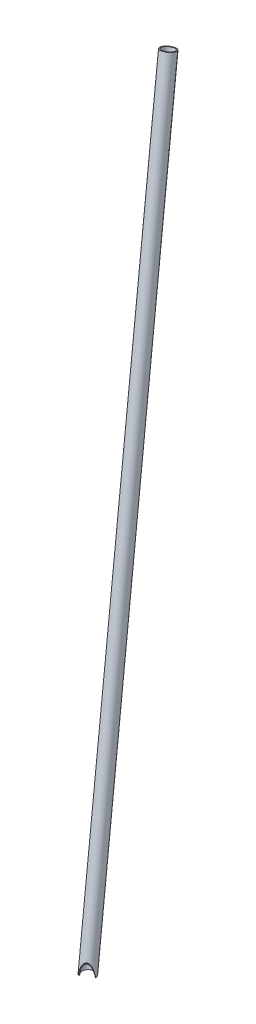
ISO-10303-21;
HEADER;
FILE_DESCRIPTION(('STEP AP214'),'2;1');
FILE_NAME('part.step','',(''),(''),'','','');
FILE_SCHEMA(('AUTOMOTIVE_DESIGN { 1 0 10303 214 1 1 1 1 }'));
ENDSEC;
DATA;
#1=APPLICATION_CONTEXT('core data for automotive mechanical design processes');
#2=APPLICATION_PROTOCOL_DEFINITION('international standard','automotive_design',2000,#1);
#3=PRODUCT_CONTEXT('',#1,'mechanical');
#4=PRODUCT('Part','Part','',(#3));
#5=PRODUCT_RELATED_PRODUCT_CATEGORY('part','',(#4));
#6=PRODUCT_DEFINITION_FORMATION('','',#4);
#7=PRODUCT_DEFINITION_CONTEXT('part definition',#1,'design');
#8=PRODUCT_DEFINITION('design','',#6,#7);
#9=PRODUCT_DEFINITION_SHAPE('','',#8);
#10=(LENGTH_UNIT() NAMED_UNIT(*) SI_UNIT(.MILLI.,.METRE.));
#11=(NAMED_UNIT(*) PLANE_ANGLE_UNIT() SI_UNIT($,.RADIAN.));
#12=(NAMED_UNIT(*) SI_UNIT($,.STERADIAN.) SOLID_ANGLE_UNIT());
#13=UNCERTAINTY_MEASURE_WITH_UNIT(LENGTH_MEASURE(1.E-05),#10,'distance_accuracy_value','');
#14=(GEOMETRIC_REPRESENTATION_CONTEXT(3) GLOBAL_UNCERTAINTY_ASSIGNED_CONTEXT((#13)) GLOBAL_UNIT_ASSIGNED_CONTEXT((#10,
#11,#12)) REPRESENTATION_CONTEXT('',''));
#15=CARTESIAN_POINT('',(0.,0.,0.));
#16=DIRECTION('',(0.,0.,1.));
#17=DIRECTION('',(1.,0.,0.));
#18=AXIS2_PLACEMENT_3D('',#15,#16,#17);
#19=CARTESIAN_POINT('',(250.,1.11022302462516E-13,-1700.));
#20=DIRECTION('',(-0.140336447675245,0.956366902675742,-0.256257739239816));
#21=DIRECTION('',(0.,0.258819045102517,0.965925826289069));
#22=AXIS2_PLACEMENT_3D('',#19,#20,#21);
#23=CYLINDRICAL_SURFACE('',#22,7.90000000000002);
#24=CARTESIAN_POINT('',(247.02688014993,22.3059316567872,-1697.79817454862));
#25=CARTESIAN_POINT('',(246.897230024097,22.1083342257185,-1697.7452263696));
#26=CARTESIAN_POINT('',(246.772514884946,21.9064915936007,-1697.69597642428));
#27=CARTESIAN_POINT('',(246.531632915779,21.4962913928115,-1697.60396431536));
#28=CARTESIAN_POINT('',(246.415469347105,21.2879313813088,-1697.56120462042));
#29=CARTESIAN_POINT('',(246.190485072449,20.8658404013037,-1697.48143432392));
#30=CARTESIAN_POINT('',(246.081674882731,20.6521023164945,-1697.44443186144));
#31=CARTESIAN_POINT('',(245.870690561491,20.220592835496,-1697.37571259438));
#32=CARTESIAN_POINT('',(245.768515631093,20.0028219289261,-1697.34399515277));
#33=CARTESIAN_POINT('',(245.56930824599,19.5623765931673,-1697.28521339645));
#34=CARTESIAN_POINT('',(245.47231897334,19.339677922274,-1697.25818489174));
#35=CARTESIAN_POINT('',(245.283654118844,18.8915257835523,-1697.20875916257));
#36=CARTESIAN_POINT('',(245.191979001067,18.6660720772105,-1697.18636234215));
#37=CARTESIAN_POINT('',(244.924230548213,17.9866730843641,-1697.12579739923));
#38=CARTESIAN_POINT('',(244.755265021636,17.5293099104588,-1697.09420518773));
#39=CARTESIAN_POINT('',(244.494879339238,16.7855656296779,-1697.05667906413));
#40=CARTESIAN_POINT('',(244.398631224781,16.5010873399011,-1697.04554992038));
#41=CARTESIAN_POINT('',(244.211349198765,15.9302231024051,-1697.02965612067));
#42=CARTESIAN_POINT('',(244.12031544369,15.6438370977223,-1697.02489165563));
#43=CARTESIAN_POINT('',(243.942824597102,15.0694384173663,-1697.02190040254));
#44=CARTESIAN_POINT('',(243.856370213951,14.7814248881377,-1697.02367744045));
#45=CARTESIAN_POINT('',(243.6875630043,14.2043282772833,-1697.03413793823));
#46=CARTESIAN_POINT('',(243.605210087314,13.9152452194044,-1697.04282124565));
#47=CARTESIAN_POINT('',(243.444529896558,13.3379076074676,-1697.06760242797));
#48=CARTESIAN_POINT('',(243.366183822315,13.049656626866,-1697.08366128966));
#49=CARTESIAN_POINT('',(243.212592422191,12.4728760762426,-1697.12400947113));
#50=CARTESIAN_POINT('',(243.137347299321,12.1843464892427,-1697.14829932882));
#51=CARTESIAN_POINT('',(242.989580963977,11.607754497176,-1697.20625762543));
#52=CARTESIAN_POINT('',(242.917057742486,11.319691903913,-1697.23991898644));
#53=CARTESIAN_POINT('',(242.774277386315,10.744526719946,-1697.31823847948));
#54=CARTESIAN_POINT('',(242.704019830467,10.4574239598153,-1697.36289455422));
#55=CARTESIAN_POINT('',(242.583318013298,9.95903009553073,-1697.4522075741));
#56=CARTESIAN_POINT('',(242.53244330234,9.74731121833546,-1697.49388514516));
#57=CARTESIAN_POINT('',(242.431650096973,9.3254764730985,-1697.58573669226));
#58=CARTESIAN_POINT('',(242.381731590056,9.11536058410989,-1697.63591055708));
#59=CARTESIAN_POINT('',(242.282706242084,8.69698634977353,-1697.74638354004));
#60=CARTESIAN_POINT('',(242.233601770432,8.48873403896588,-1697.8067079202));
#61=CARTESIAN_POINT('',(242.136449564854,8.07573373456303,-1697.93923568417));
#62=CARTESIAN_POINT('',(242.088401890844,7.87098593980351,-1698.01143973955));
#63=CARTESIAN_POINT('',(241.992857156138,7.46290686020257,-1698.17132522457));
#64=CARTESIAN_POINT('',(241.945386020607,7.25966913288363,-1698.25926436237));
#65=CARTESIAN_POINT('',(241.85268487176,6.86078816567063,-1698.45217985527));
#66=CARTESIAN_POINT('',(241.807454972283,6.66514531165063,-1698.55715707464));
#67=CARTESIAN_POINT('',(241.720851950301,6.28552972299374,-1698.7858161731));
#68=CARTESIAN_POINT('',(241.679459878051,6.10150125961276,-1698.90939726193));
#69=CARTESIAN_POINT('',(241.602379146249,5.74765270894294,-1699.17697362791));
#70=CARTESIAN_POINT('',(241.566686275014,5.57782217409105,-1699.32095368043));
#71=CARTESIAN_POINT('',(241.513402110687,5.30529454779575,-1699.58145988783));
#72=CARTESIAN_POINT('',(241.493621035359,5.1980266739728,-1699.69279065001));
#73=CARTESIAN_POINT('',(241.45904595535,4.99264615677945,-1699.92431627413));
#74=CARTESIAN_POINT('',(241.444251254099,4.89453223603746,-1700.04450989511));
#75=CARTESIAN_POINT('',(241.420552817406,4.70778223532026,-1700.29279839605));
#76=CARTESIAN_POINT('',(241.41165580788,4.61915707283636,-1700.42090211563));
#77=CARTESIAN_POINT('',(241.400574092195,4.45149219635069,-1700.68351075842));
#78=CARTESIAN_POINT('',(241.39838987884,4.37245318650371,-1700.81801615086));
#79=CARTESIAN_POINT('',(241.401350285497,4.22402356532311,-1701.0911109572));
#80=CARTESIAN_POINT('',(241.40645124162,4.15457818365956,-1701.22967120449));
#81=CARTESIAN_POINT('',(241.424343018824,4.02413400842025,-1701.51020861628));
#82=CARTESIAN_POINT('',(241.437133803629,3.96313517500031,-1701.65218576466));
#83=CARTESIAN_POINT('',(241.470700963952,3.84876889879651,-1701.93831396657));
#84=CARTESIAN_POINT('',(241.491480956521,3.79540492767333,-1702.08246597631));
#85=CARTESIAN_POINT('',(241.541194031402,3.69550391099853,-1702.37173437741));
#86=CARTESIAN_POINT('',(241.570128333775,3.6489678886419,-1702.51685090992));
#87=CARTESIAN_POINT('',(241.641302921631,3.55523560766826,-1702.82930571212));
#88=CARTESIAN_POINT('',(241.684904345027,3.50903581218809,-1702.99663358932));
#89=CARTESIAN_POINT('',(241.783053820528,3.42352892962098,-1703.32982846406));
#90=CARTESIAN_POINT('',(241.837602646755,3.38422233034004,-1703.49569535742));
#91=CARTESIAN_POINT('',(241.957567542264,3.31150991137228,-1703.82483193606));
#92=CARTESIAN_POINT('',(242.022987214122,3.27810605544044,-1703.98810074061));
#93=CARTESIAN_POINT('',(242.164507964506,3.21638312784203,-1704.31093211043));
#94=CARTESIAN_POINT('',(242.240609897625,3.18806446341012,-1704.47049437798));
#95=CARTESIAN_POINT('',(242.418420349936,3.1309495985652,-1704.81425989489));
#96=CARTESIAN_POINT('',(242.522257999659,3.1030475069652,-1704.99751503604));
#97=CARTESIAN_POINT('',(242.744131329493,3.05249227057389,-1705.3559924831));
#98=CARTESIAN_POINT('',(242.862168536989,3.02983969121828,-1705.53121392206));
#99=CARTESIAN_POINT('',(243.111852496659,2.98905827554971,-1705.87232784362));
#100=CARTESIAN_POINT('',(243.243503777358,2.97093095138726,-1706.03821719353));
#101=CARTESIAN_POINT('',(243.519637873026,2.93866327614331,-1706.35935931059));
#102=CARTESIAN_POINT('',(243.664120641717,2.92452291068301,-1706.5146121161));
#103=CARTESIAN_POINT('',(243.972005223475,2.89926035492251,-1706.82023361771));
#104=CARTESIAN_POINT('',(244.135971948418,2.88830719960703,-1706.97004789611));
#105=CARTESIAN_POINT('',(244.475916408687,2.87001985259347,-1707.25562147768));
#106=CARTESIAN_POINT('',(244.651894613171,2.8626858023468,-1707.39138023133));
#107=CARTESIAN_POINT('',(245.014625101376,2.85146898871207,-1707.64779424637));
#108=CARTESIAN_POINT('',(245.201376957081,2.84758608831688,-1707.76845010717));
#109=CARTESIAN_POINT('',(245.584323950589,2.84323032018274,-1707.99377239865));
#110=CARTESIAN_POINT('',(245.780518953462,2.84275740373423,-1708.09843905772));
#111=CARTESIAN_POINT('',(246.179795519347,2.84529810733267,-1708.29051066619));
#112=CARTESIAN_POINT('',(246.382831913726,2.84829204487045,-1708.37800979691));
#113=CARTESIAN_POINT('',(246.795357133017,2.85794199994654,-1708.53592740542));
#114=CARTESIAN_POINT('',(247.004845967786,2.8645980230789,-1708.60634585713));
#115=CARTESIAN_POINT('',(247.428770828113,2.88191542480601,-1708.72972804798));
#116=CARTESIAN_POINT('',(247.643207537136,2.89257735989547,-1708.78268936009));
#117=CARTESIAN_POINT('',(248.07541944083,2.91839980221602,-1708.87093441629));
#118=CARTESIAN_POINT('',(248.293194622048,2.93356029132338,-1708.90621823161));
#119=CARTESIAN_POINT('',(248.7312683794,2.96911390976135,-1708.95917167383));
#120=CARTESIAN_POINT('',(248.951573277631,2.98952600788944,-1708.97677628892));
#121=CARTESIAN_POINT('',(249.392252490683,3.03644538713307,-1708.9942925016));
#122=CARTESIAN_POINT('',(249.612626808572,3.06295299246059,-1708.99420315786));
#123=CARTESIAN_POINT('',(250.051709824062,3.12320837273484,-1708.97667308602));
#124=CARTESIAN_POINT('',(250.270418393374,3.15695669960755,-1708.95923103484));
#125=CARTESIAN_POINT('',(250.704301169476,3.23313631142059,-1708.90755908916));
#126=CARTESIAN_POINT('',(250.919475944015,3.27556618652005,-1708.87333191923));
#127=CARTESIAN_POINT('',(251.309573588191,3.36310784021261,-1708.79584798553));
#128=CARTESIAN_POINT('',(251.485327362265,3.40664788470186,-1708.75498130431));
#129=CARTESIAN_POINT('',(251.831682141261,3.50230201346856,-1708.66280013763));
#130=CARTESIAN_POINT('',(252.002283965985,3.55441472502234,-1708.61148732457));
#131=CARTESIAN_POINT('',(252.336694635672,3.66852102760673,-1708.49941840225));
#132=CARTESIAN_POINT('',(252.500512379707,3.73050112199456,-1708.43867519469));
#133=CARTESIAN_POINT('',(252.819992432913,3.86582520094134,-1708.30893348875));
#134=CARTESIAN_POINT('',(252.975656293141,3.93916701365929,-1708.23993656867));
#135=CARTESIAN_POINT('',(253.252206365326,4.08535531724691,-1708.10724711853));
#136=CARTESIAN_POINT('',(253.374590577554,4.15628343175465,-1708.04456029082));
#137=CARTESIAN_POINT('',(253.611452931414,4.30752941026716,-1707.91569959542));
#138=CARTESIAN_POINT('',(253.725932746026,4.38784527758661,-1707.84952647088));
#139=CARTESIAN_POINT('',(253.9459575018,4.55805154531534,-1707.71503254341));
#140=CARTESIAN_POINT('',(254.051511745365,4.64793175124106,-1707.64671408087));
#141=CARTESIAN_POINT('',(254.253093954462,4.83720382239802,-1707.5091946362));
#142=CARTESIAN_POINT('',(254.349121832455,4.93659577501607,-1707.43999364597));
#143=CARTESIAN_POINT('',(254.531124175197,5.14420717008951,-1707.30205985031));
#144=CARTESIAN_POINT('',(254.617110927377,5.25241554242586,-1707.23332657166));
#145=CARTESIAN_POINT('',(254.779135252888,5.47686557948045,-1707.09730448429));
#146=CARTESIAN_POINT('',(254.855172736012,5.59310731702148,-1707.03001568866));
#147=CARTESIAN_POINT('',(254.997679855294,5.83260775225091,-1706.89761313523));
#148=CARTESIAN_POINT('',(255.06414224638,5.95587166594138,-1706.83250105277));
#149=CARTESIAN_POINT('',(255.188052537654,6.20820501599354,-1706.70496131261));
#150=CARTESIAN_POINT('',(255.245497287447,6.33727646109659,-1706.64253459859));
#151=CARTESIAN_POINT('',(255.388610173217,6.69004363029502,-1706.47887732129));
#152=CARTESIAN_POINT('',(255.466700869831,6.91806515432445,-1706.38031752682));
#153=CARTESIAN_POINT('',(255.603400834746,7.38310846669575,-1706.19124328796));
#154=CARTESIAN_POINT('',(255.661994309947,7.62013737887798,-1706.10073540903));
#155=CARTESIAN_POINT('',(255.763445205547,8.10111751672776,-1705.92635732169));
#156=CARTESIAN_POINT('',(255.806230017073,8.34509527227057,-1705.84251909522));
#157=CARTESIAN_POINT('',(255.878547200538,8.83676746053743,-1705.68069394348));
#158=CARTESIAN_POINT('',(255.908083575313,9.08446074725814,-1705.60270525678));
#159=CARTESIAN_POINT('',(255.967818730922,9.7031070583066,-1705.41454158668));
#160=CARTESIAN_POINT('',(255.991379256598,10.0755279317065,-1705.30711951232));
#161=CARTESIAN_POINT('',(256.019181224092,10.8229993405136,-1705.09888572202));
#162=CARTESIAN_POINT('',(256.023413228766,11.1980510709537,-1704.99807725883));
#163=CARTESIAN_POINT('',(256.01553498595,11.9497307305775,-1704.80025333021));
#164=CARTESIAN_POINT('',(256.003392936761,12.3263603066378,-1704.70324562352));
#165=CARTESIAN_POINT('',(255.964517857834,13.0792541122951,-1704.51114522706));
#166=CARTESIAN_POINT('',(255.937787648511,13.4555183984336,-1704.41605217081));
#167=CARTESIAN_POINT('',(255.870584255724,14.2079125345928,-1704.22579510562));
#168=CARTESIAN_POINT('',(255.830073170908,14.5840391189148,-1704.13063163108));
#169=CARTESIAN_POINT('',(255.735624998883,15.3343131436124,-1703.93902633683));
#170=CARTESIAN_POINT('',(255.681686762286,15.7084604117535,-1703.84258440835));
#171=CARTESIAN_POINT('',(255.56024246233,16.4532918579644,-1703.64724529319));
#172=CARTESIAN_POINT('',(255.492757050693,16.8239804192244,-1703.54835204212));
#173=CARTESIAN_POINT('',(255.343432738583,17.5613503077657,-1703.34668418259));
#174=CARTESIAN_POINT('',(255.261596057365,17.9280322453243,-1703.24391017617));
#175=CARTESIAN_POINT('',(255.080842181632,18.6617849976919,-1703.03142858851));
#176=CARTESIAN_POINT('',(254.981675770816,19.0287705928605,-1702.92163717081));
#177=CARTESIAN_POINT('',(254.765018935769,19.7554065005978,-1702.6949031499));
#178=CARTESIAN_POINT('',(254.64751826994,20.1150525855375,-1702.57795657212));
#179=CARTESIAN_POINT('',(254.455627192594,20.6452736541918,-1702.39610985059));
#180=CARTESIAN_POINT('',(254.389284956967,20.8199487165267,-1702.33462230108));
#181=CARTESIAN_POINT('',(254.250797158894,21.1660458104617,-1702.20910627996));
#182=CARTESIAN_POINT('',(254.178652299157,21.3374682328651,-1702.1450781165));
#183=CARTESIAN_POINT('',(254.028018371691,21.6762056934865,-1702.01420503514));
#184=CARTESIAN_POINT('',(253.949535225398,21.8435243792785,-1701.94736277358));
#185=CARTESIAN_POINT('',(253.785448912518,22.1732473557296,-1701.81044022955));
#186=CARTESIAN_POINT('',(253.699847581755,22.335652898873,-1701.74036078403));
#187=CARTESIAN_POINT('',(253.549629291668,22.6027564813702,-1701.6197966609));
#188=CARTESIAN_POINT('',(253.487184150128,22.7091241898993,-1701.57030846218));
#189=CARTESIAN_POINT('',(253.358316877359,22.918520647772,-1701.46950861992));
#190=CARTESIAN_POINT('',(253.291894830761,23.0215494680961,-1701.41819701519));
#191=CARTESIAN_POINT('',(253.085899188253,23.3251019135966,-1701.26110887287));
#192=CARTESIAN_POINT('',(252.939768638334,23.5197778565167,-1701.15231819571));
#193=CARTESIAN_POINT('',(252.625533715419,23.8882661345266,-1700.92449248));
#194=CARTESIAN_POINT('',(252.457226048492,24.0618527421055,-1700.80536665291));
#195=CARTESIAN_POINT('',(252.097052268726,24.3742741281847,-1700.5573318728));
#196=CARTESIAN_POINT('',(251.905254255656,24.5132059762749,-1700.42845159483));
#197=CARTESIAN_POINT('',(251.56435931373,24.7036573913164,-1700.20574912958));
#198=CARTESIAN_POINT('',(251.421581462986,24.7689133771548,-1700.11410936122));
#199=CARTESIAN_POINT('',(251.127374790285,24.8709739015664,-1699.92886875559));
#200=CARTESIAN_POINT('',(250.975956645506,24.9078127723038,-1699.8352704255));
#201=CARTESIAN_POINT('',(250.667467279213,24.949405217973,-1699.64825376529));
#202=CARTESIAN_POINT('',(250.510370817404,24.953991441449,-1699.55483888475));
#203=CARTESIAN_POINT('',(250.196456565916,24.9302391546662,-1699.37178684031));
#204=CARTESIAN_POINT('',(250.039638924761,24.9018865139146,-1699.28215131483));
#205=CARTESIAN_POINT('',(249.739815343801,24.818064648679,-1699.11405127587));
#206=CARTESIAN_POINT('',(249.596531458446,24.7642318480767,-1699.03524128273));
#207=CARTESIAN_POINT('',(249.316731887839,24.6346655890388,-1698.88408957481));
#208=CARTESIAN_POINT('',(249.180220206483,24.5589193514306,-1698.81175166665));
#209=CARTESIAN_POINT('',(248.81475383178,24.3262015326341,-1698.62152636251));
#210=CARTESIAN_POINT('',(248.593789946847,24.1510733823289,-1698.51046683355));
#211=CARTESIAN_POINT('',(248.280090538462,23.8627072313137,-1698.35759324612));
#212=CARTESIAN_POINT('',(248.178312706969,23.7620993920191,-1698.30884512716));
#213=CARTESIAN_POINT('',(247.980199144551,23.5538310349667,-1698.21550000805));
#214=CARTESIAN_POINT('',(247.88386202689,23.4461723295895,-1698.17090194823));
#215=CARTESIAN_POINT('',(247.652822641892,23.1740488497293,-1698.0657339185));
#216=CARTESIAN_POINT('',(247.520979090414,23.0063363332563,-1698.00731449505));
#217=CARTESIAN_POINT('',(247.330458959693,22.7481567451238,-1697.92503568459));
#218=CARTESIAN_POINT('',(247.268222961963,22.6610924491842,-1697.89852683126));
#219=CARTESIAN_POINT('',(247.145943751962,22.484955942718,-1697.84714800367));
#220=CARTESIAN_POINT('',(247.085900604544,22.3958836729325,-1697.82227807784));
#221=CARTESIAN_POINT('',(247.02688014993,22.3059316567872,-1697.79817454862));
#222=B_SPLINE_CURVE_WITH_KNOTS('',3,(#24,#25,#26,#27,#28,#29,#30,#31,#32,#33,#34,#35,#36,#37,
#38,#39,#40,#41,#42,#43,#44,#45,#46,#47,#48,#49,#50,#51,#52,#53,#54,#55,#56,#57,#58,#59,#60,#61,
#62,#63,#64,#65,#66,#67,#68,#69,#70,#71,#72,#73,#74,#75,#76,#77,#78,#79,#80,#81,#82,#83,#84,#85,
#86,#87,#88,#89,#90,#91,#92,#93,#94,#95,#96,#97,#98,#99,#100,#101,#102,#103,#104,#105,#106,#107,
#108,#109,#110,#111,#112,#113,#114,#115,#116,#117,#118,#119,#120,#121,#122,#123,#124,#125,#126,
#127,#128,#129,#130,#131,#132,#133,#134,#135,#136,#137,#138,#139,#140,#141,#142,#143,#144,#145,
#146,#147,#148,#149,#150,#151,#152,#153,#154,#155,#156,#157,#158,#159,#160,#161,#162,#163,#164,
#165,#166,#167,#168,#169,#170,#171,#172,#173,#174,#175,#176,#177,#178,#179,#180,#181,#182,#183,
#184,#185,#186,#187,#188,#189,#190,#191,#192,#193,#194,#195,#196,#197,#198,#199,#200,#201,#202,
#203,#204,#205,#206,#207,#208,#209,#210,#211,#212,#213,#214,#215,#216,#217,#218,#219,#220,#221),
.UNSPECIFIED.,.T.,.F.,(4,2,2,2,2,2,2,2,2,2,2,2,2,2,2,2,2,2,2,2,2,2,2,2,2,2,2,2,2,2,2,2,2,2,2,2,
2,2,2,2,2,2,2,2,2,2,2,2,2,2,2,2,2,2,2,2,2,2,2,2,2,2,2,2,2,2,2,2,2,2,2,2,2,2,2,2,2,2,2,2,2,2,2,2,
2,2,2,2,2,2,2,2,2,2,2,2,2,2,4),(0.,0.726530294055584,1.45333624724192,2.18116054136567,
2.90889704321163,3.64196763023514,4.37510213790026,5.84011636279712,6.74159977625783,
7.64311022947817,8.54514803942276,9.44716594008354,10.3444665865191,11.2418258838905,
12.1385092711488,13.0350249999876,13.69998060553,14.3649275068842,15.0315544521351,
15.6982190952456,16.3770137559658,17.0558428593075,17.7311184823892,18.4058927472486,
18.8729173357913,19.3398766564659,19.8073676005118,20.2748928635265,20.7396277305046,
21.2043604051551,21.6693037320759,22.13431666158,22.6707539712194,23.2072292272377,
23.7438826259554,24.2805789820523,24.9172724353481,25.5540344363553,26.191008932552,
26.8279811314957,27.4942950292712,28.1606349676195,28.8269484517709,29.4932524180185,
30.1557920205296,30.818332635109,31.4809653227932,32.1435953409059,32.8086532265674,
33.4737464939647,34.138890476301,34.8039265281252,35.3602694858401,35.9165234440568,
36.4720229915491,37.0274164836591,37.4910910508609,37.9546671777522,38.4177540435471,
38.8808451642468,39.3433635214814,39.8058860720147,40.2687567763718,40.7317888306128,
41.5115933197449,42.2920279355183,43.0760037805377,43.8597425980403,45.0239258210084,
46.1886773953076,47.3556944119802,48.5224858822071,49.6925126614729,50.8626396315718,
52.0309961888252,53.1991722325161,54.3857872368448,55.5730674783949,56.1630839792572,
56.7530291351875,57.3424293829666,57.9316780894476,58.3302724677783,58.7288583669373,
59.5271786449543,60.3334054459361,61.1373479474673,61.6806157033488,62.2232260773216,
62.7686498662357,63.314307723745,63.8288871611765,64.3437672908703,65.2472469682712,
65.7006414771503,66.1539198978018,66.8167992614297,67.1475269092076,67.4782643301722),.UNSPECIFIED.);
#223=CARTESIAN_POINT('',(255.983691368383,10.,-1705.33008309093));
#224=VERTEX_POINT('',#223);
#225=CARTESIAN_POINT('',(242.593324865928,9.99999999999513,-1697.44569111518));
#226=VERTEX_POINT('',#225);
#227=EDGE_CURVE('E84',#224,#226,#222,.T.);
#228=ORIENTED_EDGE('',*,*,#227,.T.);
#229=CARTESIAN_POINT('',(248.532608695652,10.,-1702.67949192431));
#230=DIRECTION('',(0.,-1.,0.));
#231=DIRECTION('',(-0.480327336741099,0.,-0.87708930536132));
#232=AXIS2_PLACEMENT_3D('',#229,#230,#231);
#233=ELLIPSE('',#232,8.26042806154965,7.90000000000002);
#234=EDGE_CURVE('E75',#226,#224,#233,.T.);
#235=ORIENTED_EDGE('',*,*,#234,.T.);
#236=EDGE_LOOP('',(#228,#235));
#237=FACE_BOUND('',#236,.T.);
#238=CARTESIAN_POINT('',(115.,920.,-1946.51325703663));
#239=DIRECTION('',(-0.140336447675245,0.956366902675742,-0.256257739239816));
#240=DIRECTION('',(0.,0.258819045102518,0.965925826289069));
#241=AXIS2_PLACEMENT_3D('',#238,#239,#240);
#242=CIRCLE('',#241,7.90000000000002);
#243=CARTESIAN_POINT('',(115.,922.04467045631,-1938.88244300895));
#244=VERTEX_POINT('',#243);
#245=EDGE_CURVE('E43',#244,#244,#242,.T.);
#246=ORIENTED_EDGE('',*,*,#245,.T.);
#247=EDGE_LOOP('',(#246));
#248=FACE_BOUND('',#247,.T.);
#249=ADVANCED_FACE('F39',(#237,#248),#23,.F.);
#250=CARTESIAN_POINT('',(250.,1.11022302462516E-13,-1700.));
#251=DIRECTION('',(-0.140336447675245,0.956366902675742,-0.256257739239816));
#252=DIRECTION('',(0.,0.258819045102517,0.965925826289069));
#253=AXIS2_PLACEMENT_3D('',#250,#251,#252);
#254=CYLINDRICAL_SURFACE('',#253,9.49999999999999);
#255=CARTESIAN_POINT('',(248.532608695652,10.,-1702.67949192431));
#256=DIRECTION('',(0.,-1.,0.));
#257=DIRECTION('',(-0.480327336741099,0.,-0.87708930536132));
#258=AXIS2_PLACEMENT_3D('',#255,#256,#257);
#259=ELLIPSE('',#258,9.93342614996473,9.49999999999999);
#260=CARTESIAN_POINT('',(242.78224015655,10.,-1695.0300997733));
#261=VERTEX_POINT('',#260);
#262=CARTESIAN_POINT('',(239.809985624827,10.,-1698.90694898628));
#263=VERTEX_POINT('',#262);
#264=EDGE_CURVE('E49',#261,#263,#259,.T.);
#265=ORIENTED_EDGE('',*,*,#264,.F.);
#266=CARTESIAN_POINT('',(250.,8.16716449652246E-13,-1700.));
#267=DIRECTION('',(-0.508456010272344,0.0599232902931692,-0.859000398660194));
#268=DIRECTION('',(0.0394871934442316,0.998148808069163,0.0462570913915509));
#269=AXIS2_PLACEMENT_3D('',#266,#267,#268);
#270=ELLIPSE('',#269,27.2370926599014,9.49999999999999);
#271=CARTESIAN_POINT('',(257.987111759544,10.,-1704.0301053193));
#272=VERTEX_POINT('',#271);
#273=EDGE_CURVE('E90',#272,#261,#270,.F.);
#274=ORIENTED_EDGE('',*,*,#273,.F.);
#275=CARTESIAN_POINT('',(238.930875304719,10.,-1703.04544252495));
#276=VERTEX_POINT('',#275);
#277=EDGE_CURVE('E150',#276,#272,#259,.T.);
#278=ORIENTED_EDGE('',*,*,#277,.F.);
#279=CARTESIAN_POINT('',(231.034262268949,129.24799046346,-1734.63189466803));
#280=DIRECTION('',(0.970142500145332,0.,-0.242535625036333));
#281=DIRECTION('',(-0.0687394638953398,0.958995862221251,-0.274957855581359));
#282=AXIS2_PLACEMENT_3D('',#279,#280,#281);
#283=ELLIPSE('',#282,128.387536830015,9.49999999999999);
#284=CARTESIAN_POINT('',(239.858774037238,6.12393332948363,-1699.33384759487));
#285=VERTEX_POINT('',#284);
#286=EDGE_CURVE('E140',#285,#276,#283,.T.);
#287=ORIENTED_EDGE('',*,*,#286,.F.);
#288=CARTESIAN_POINT('',(241.672714271624,56.7489101489333,-1715.20582464575));
#289=DIRECTION('',(0.993532672656404,0.,0.113546591160732));
#290=DIRECTION('',(0.02749290338581,0.970244108037456,-0.240562904625837));
#291=AXIS2_PLACEMENT_3D('',#288,#289,#290);
#292=ELLIPSE('',#291,56.3711108055407,9.49999999999999);
#293=EDGE_CURVE('E91',#263,#285,#292,.T.);
#294=ORIENTED_EDGE('',*,*,#293,.F.);
#295=EDGE_LOOP('',(#265,#274,#278,#287,#294));
#296=FACE_BOUND('',#295,.T.);
#297=CARTESIAN_POINT('',(115.,920.,-1946.51325703663));
#298=DIRECTION('',(-0.140336447675245,0.956366902675742,-0.256257739239816));
#299=DIRECTION('',(0.,0.258819045102518,0.965925826289069));
#300=AXIS2_PLACEMENT_3D('',#297,#298,#299);
#301=CIRCLE('',#300,9.49999999999999);
#302=CARTESIAN_POINT('',(115.,922.458780928474,-1937.33696168688));
#303=VERTEX_POINT('',#302);
#304=EDGE_CURVE('E11',#303,#303,#301,.T.);
#305=ORIENTED_EDGE('',*,*,#304,.F.);
#306=EDGE_LOOP('',(#305));
#307=FACE_BOUND('',#306,.T.);
#308=ADVANCED_FACE('F108',(#296,#307),#254,.T.);
#309=CARTESIAN_POINT('',(325.,320.,-1580.));
#310=DIRECTION('',(-0.214351342090107,-0.914565726251124,-0.342962147344171));
#311=DIRECTION('',(0.,0.351123441588391,-0.936329177569045));
#312=AXIS2_PLACEMENT_3D('',#309,#310,#311);
#313=CYLINDRICAL_SURFACE('',#312,9.49999999999999);
#314=ORIENTED_EDGE('',*,*,#227,.F.);
#315=CARTESIAN_POINT('',(252.34375,10.,-1696.25));
#316=DIRECTION('',(0.,-1.,0.));
#317=DIRECTION('',(-0.52999894000318,0.,-0.847998304005088));
#318=AXIS2_PLACEMENT_3D('',#315,#316,#317);
#319=ELLIPSE('',#318,10.3874437094218,9.49999999999999);
#320=EDGE_CURVE('E80',#224,#272,#319,.T.);
#321=ORIENTED_EDGE('',*,*,#320,.T.);
#322=ORIENTED_EDGE('',*,*,#273,.T.);
#323=EDGE_CURVE('E78',#261,#226,#319,.T.);
#324=ORIENTED_EDGE('',*,*,#323,.T.);
#325=EDGE_LOOP('',(#314,#321,#322,#324));
#326=FACE_BOUND('',#325,.T.);
#327=ADVANCED_FACE('F88',(#326),#313,.F.);
#328=CARTESIAN_POINT('',(240.064673273436,10.,-1701.13546591161));
#329=DIRECTION('',(0.993532672656404,0.,0.113546591160732));
#330=DIRECTION('',(0.113546591160732,0.,-0.993532672656404));
#331=AXIS2_PLACEMENT_3D('',#328,#329,#330);
#332=PLANE('',#331);
#333=ORIENTED_EDGE('',*,*,#293,.T.);
#334=DIRECTION('',(0.,1.,0.));
#335=VECTOR('',#334,1.);
#336=CARTESIAN_POINT('',(239.858774037238,10.,-1699.33384759487));
#337=LINE('',#336,#335);
#338=CARTESIAN_POINT('',(239.858774037238,10.,-1699.33384759487));
#339=VERTEX_POINT('',#338);
#340=EDGE_CURVE('E144',#285,#339,#337,.T.);
#341=ORIENTED_EDGE('',*,*,#340,.T.);
#342=DIRECTION('',(-0.113546591160732,0.,0.993532672656404));
#343=VECTOR('',#342,1.);
#344=CARTESIAN_POINT('',(240.064673273436,10.,-1701.13546591161));
#345=LINE('',#344,#343);
#346=EDGE_CURVE('E143',#339,#263,#345,.T.);
#347=ORIENTED_EDGE('',*,*,#346,.T.);
#348=EDGE_LOOP('',(#333,#341,#347));
#349=FACE_BOUND('',#348,.T.);
#350=ADVANCED_FACE('F107',(#349),#332,.T.);
#351=CARTESIAN_POINT('',(165.298574998547,10.,-1997.57464374964));
#352=DIRECTION('',(0.970142500145332,0.,-0.242535625036333));
#353=DIRECTION('',(-0.242535625036333,0.,-0.970142500145332));
#354=AXIS2_PLACEMENT_3D('',#351,#352,#353);
#355=PLANE('',#354);
#356=ORIENTED_EDGE('',*,*,#286,.T.);
#357=DIRECTION('',(0.242535625036333,0.,0.970142500145332));
#358=VECTOR('',#357,1.);
#359=CARTESIAN_POINT('',(165.298574998547,10.,-1997.57464374964));
#360=LINE('',#359,#358);
#361=EDGE_CURVE('E142',#276,#339,#360,.T.);
#362=ORIENTED_EDGE('',*,*,#361,.T.);
#363=ORIENTED_EDGE('',*,*,#340,.F.);
#364=EDGE_LOOP('',(#356,#362,#363));
#365=FACE_BOUND('',#364,.T.);
#366=ADVANCED_FACE('F111',(#365),#355,.T.);
#367=CARTESIAN_POINT('',(259.935326726564,10.,-1698.86453408839));
#368=DIRECTION('',(0.,-1.,0.));
#369=DIRECTION('',(0.,0.,-1.));
#370=AXIS2_PLACEMENT_3D('',#367,#368,#369);
#371=PLANE('',#370);
#372=ORIENTED_EDGE('',*,*,#277,.T.);
#373=ORIENTED_EDGE('',*,*,#320,.F.);
#374=ORIENTED_EDGE('',*,*,#234,.F.);
#375=ORIENTED_EDGE('',*,*,#323,.F.);
#376=ORIENTED_EDGE('',*,*,#264,.T.);
#377=ORIENTED_EDGE('',*,*,#346,.F.);
#378=ORIENTED_EDGE('',*,*,#361,.F.);
#379=EDGE_LOOP('',(#372,#373,#374,#375,#376,#377,#378));
#380=FACE_BOUND('',#379,.T.);
#381=ADVANCED_FACE('F77',(#380),#371,.T.);
#382=CARTESIAN_POINT('',(115.,920.,-1946.51325703663));
#383=DIRECTION('',(-0.140336447675245,0.956366902675742,-0.256257739239816));
#384=DIRECTION('',(0.,0.258819045102518,0.965925826289069));
#385=AXIS2_PLACEMENT_3D('',#382,#383,#384);
#386=PLANE('',#385);
#387=ORIENTED_EDGE('',*,*,#245,.F.);
#388=EDGE_LOOP('',(#387));
#389=FACE_BOUND('',#388,.T.);
#390=ORIENTED_EDGE('',*,*,#304,.T.);
#391=EDGE_LOOP('',(#390));
#392=FACE_BOUND('',#391,.T.);
#393=ADVANCED_FACE('F41',(#389,#392),#386,.T.);
#394=CLOSED_SHELL('',(#249,#308,#327,#350,#366,#381,#393));
#395=MANIFOLD_SOLID_BREP('B2',#394);
#396=ADVANCED_BREP_SHAPE_REPRESENTATION('',(#18,#395),#14);
#397=SHAPE_DEFINITION_REPRESENTATION(#9,#396);
ENDSEC;
END-ISO-10303-21;
